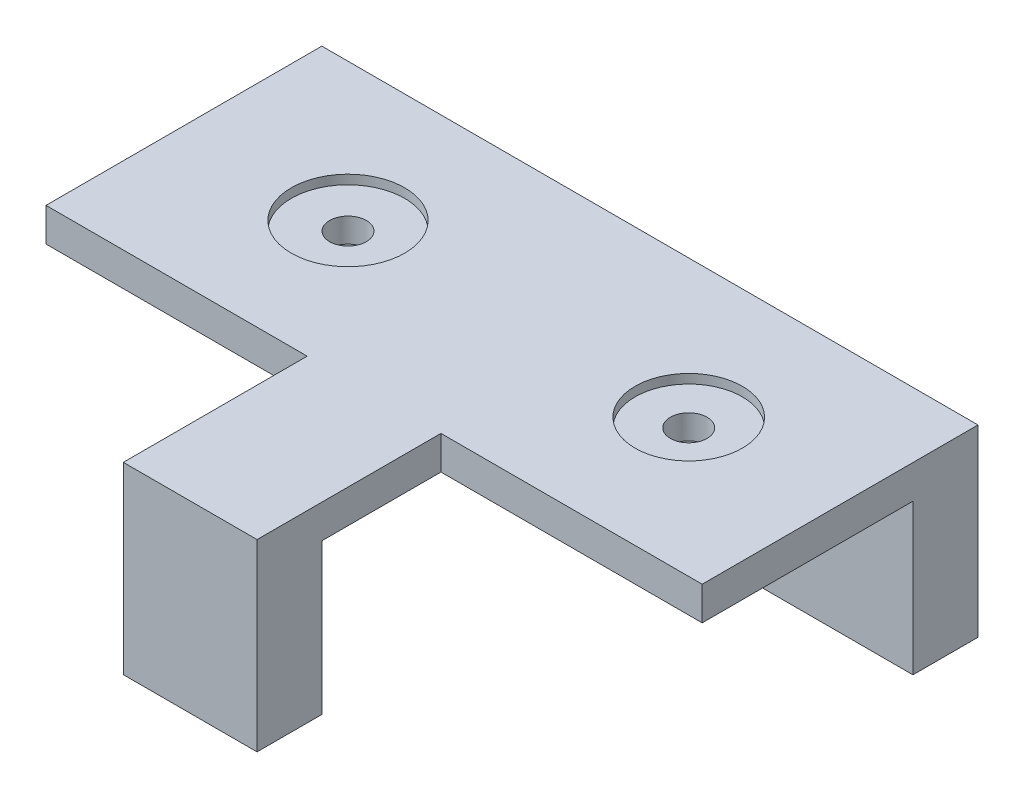
ISO-10303-21;
HEADER;
FILE_DESCRIPTION(('STEP AP214'),'2;1');
FILE_NAME('part.step','',(''),(''),'','','');
FILE_SCHEMA(('AUTOMOTIVE_DESIGN { 1 0 10303 214 1 1 1 1 }'));
ENDSEC;
DATA;
#1=APPLICATION_CONTEXT('core data for automotive mechanical design processes');
#2=APPLICATION_PROTOCOL_DEFINITION('international standard','automotive_design',2000,#1);
#3=PRODUCT_CONTEXT('',#1,'mechanical');
#4=PRODUCT('Part','Part','',(#3));
#5=PRODUCT_RELATED_PRODUCT_CATEGORY('part','',(#4));
#6=PRODUCT_DEFINITION_FORMATION('','',#4);
#7=PRODUCT_DEFINITION_CONTEXT('part definition',#1,'design');
#8=PRODUCT_DEFINITION('design','',#6,#7);
#9=PRODUCT_DEFINITION_SHAPE('','',#8);
#10=(LENGTH_UNIT() NAMED_UNIT(*) SI_UNIT(.MILLI.,.METRE.));
#11=(NAMED_UNIT(*) PLANE_ANGLE_UNIT() SI_UNIT($,.RADIAN.));
#12=(NAMED_UNIT(*) SI_UNIT($,.STERADIAN.) SOLID_ANGLE_UNIT());
#13=UNCERTAINTY_MEASURE_WITH_UNIT(LENGTH_MEASURE(1.E-05),#10,'distance_accuracy_value','');
#14=(GEOMETRIC_REPRESENTATION_CONTEXT(3) GLOBAL_UNCERTAINTY_ASSIGNED_CONTEXT((#13)) GLOBAL_UNIT_ASSIGNED_CONTEXT((#10,
#11,#12)) REPRESENTATION_CONTEXT('',''));
#15=CARTESIAN_POINT('',(0.,0.,0.));
#16=DIRECTION('',(0.,0.,1.));
#17=DIRECTION('',(1.,0.,0.));
#18=AXIS2_PLACEMENT_3D('',#15,#16,#17);
#19=CARTESIAN_POINT('',(57.6657292142728,0.,-30.));
#20=DIRECTION('',(0.,1.,0.));
#21=DIRECTION('',(0.,0.,1.));
#22=AXIS2_PLACEMENT_3D('',#19,#20,#21);
#23=CYLINDRICAL_SURFACE('',#22,6.);
#24=CARTESIAN_POINT('',(57.6657292142728,49.0674582250458,-30.));
#25=DIRECTION('',(0.,-1.,0.));
#26=DIRECTION('',(0.,0.,-1.));
#27=AXIS2_PLACEMENT_3D('',#24,#25,#26);
#28=CIRCLE('',#27,6.);
#29=CARTESIAN_POINT('',(57.6657292142728,49.0674582250458,-36.));
#30=VERTEX_POINT('',#29);
#31=EDGE_CURVE('E262',#30,#30,#28,.T.);
#32=ORIENTED_EDGE('',*,*,#31,.T.);
#33=EDGE_LOOP('',(#32));
#34=FACE_BOUND('',#33,.T.);
#35=CARTESIAN_POINT('',(57.6657292142728,57.,-30.));
#36=DIRECTION('',(0.,1.,0.));
#37=DIRECTION('',(0.,0.,1.));
#38=AXIS2_PLACEMENT_3D('',#35,#36,#37);
#39=CIRCLE('',#38,6.);
#40=CARTESIAN_POINT('',(57.6657292142728,57.,-24.));
#41=VERTEX_POINT('',#40);
#42=EDGE_CURVE('E48',#41,#41,#39,.F.);
#43=ORIENTED_EDGE('',*,*,#42,.F.);
#44=EDGE_LOOP('',(#43));
#45=FACE_BOUND('',#44,.T.);
#46=ADVANCED_FACE('F44',(#34,#45),#23,.F.);
#47=CARTESIAN_POINT('',(-53.5171156017352,0.,-30.));
#48=DIRECTION('',(0.,1.,0.));
#49=DIRECTION('',(0.,0.,1.));
#50=AXIS2_PLACEMENT_3D('',#47,#48,#49);
#51=CYLINDRICAL_SURFACE('',#50,6.);
#52=CARTESIAN_POINT('',(-53.5171156017352,49.0674582250458,-30.));
#53=DIRECTION('',(0.,-1.,0.));
#54=DIRECTION('',(0.,0.,-1.));
#55=AXIS2_PLACEMENT_3D('',#52,#53,#54);
#56=CIRCLE('',#55,6.);
#57=CARTESIAN_POINT('',(-53.5171156017352,49.0674582250458,-36.));
#58=VERTEX_POINT('',#57);
#59=EDGE_CURVE('E175',#58,#58,#56,.T.);
#60=ORIENTED_EDGE('',*,*,#59,.T.);
#61=EDGE_LOOP('',(#60));
#62=FACE_BOUND('',#61,.T.);
#63=CARTESIAN_POINT('',(-53.5171156017352,57.,-30.));
#64=DIRECTION('',(0.,1.,0.));
#65=DIRECTION('',(0.,0.,1.));
#66=AXIS2_PLACEMENT_3D('',#63,#64,#65);
#67=CIRCLE('',#66,6.);
#68=CARTESIAN_POINT('',(-53.5171156017352,57.,-24.));
#69=VERTEX_POINT('',#68);
#70=EDGE_CURVE('E266',#69,#69,#67,.F.);
#71=ORIENTED_EDGE('',*,*,#70,.F.);
#72=EDGE_LOOP('',(#71));
#73=FACE_BOUND('',#72,.T.);
#74=ADVANCED_FACE('F332',(#62,#73),#51,.F.);
#75=CARTESIAN_POINT('',(-107.047193877551,60.,-75.));
#76=DIRECTION('',(1.,0.,0.));
#77=DIRECTION('',(0.,0.,-1.));
#78=AXIS2_PLACEMENT_3D('',#75,#76,#77);
#79=PLANE('',#78);
#80=DIRECTION('',(0.,-1.,0.));
#81=VECTOR('',#80,1.);
#82=CARTESIAN_POINT('',(-107.047193877551,60.,15.));
#83=LINE('',#82,#81);
#84=CARTESIAN_POINT('',(-107.047193877551,60.,15.));
#85=VERTEX_POINT('',#84);
#86=CARTESIAN_POINT('',(-107.047193877551,49.0674582250458,15.));
#87=VERTEX_POINT('',#86);
#88=EDGE_CURVE('E142',#85,#87,#83,.T.);
#89=ORIENTED_EDGE('',*,*,#88,.F.);
#90=DIRECTION('',(0.,0.,1.));
#91=VECTOR('',#90,1.);
#92=CARTESIAN_POINT('',(-107.047193877551,60.,-75.));
#93=LINE('',#92,#91);
#94=CARTESIAN_POINT('',(-107.047193877551,60.,-75.));
#95=VERTEX_POINT('',#94);
#96=EDGE_CURVE('E159',#95,#85,#93,.T.);
#97=ORIENTED_EDGE('',*,*,#96,.F.);
#98=DIRECTION('',(0.,-1.,0.));
#99=VECTOR('',#98,1.);
#100=CARTESIAN_POINT('',(-107.047193877551,60.,-75.));
#101=LINE('',#100,#99);
#102=CARTESIAN_POINT('',(-107.047193877551,0.,-75.));
#103=VERTEX_POINT('',#102);
#104=EDGE_CURVE('E234',#95,#103,#101,.T.);
#105=ORIENTED_EDGE('',*,*,#104,.T.);
#106=DIRECTION('',(0.,0.,1.));
#107=VECTOR('',#106,1.);
#108=CARTESIAN_POINT('',(-107.047193877551,0.,-75.));
#109=LINE('',#108,#107);
#110=CARTESIAN_POINT('',(-107.047193877551,0.,-53.7725574944106));
#111=VERTEX_POINT('',#110);
#112=EDGE_CURVE('E240',#103,#111,#109,.T.);
#113=ORIENTED_EDGE('',*,*,#112,.T.);
#114=DIRECTION('',(0.,-1.,0.));
#115=VECTOR('',#114,1.);
#116=CARTESIAN_POINT('',(-107.047193877551,0.,-53.7725574944106));
#117=LINE('',#116,#115);
#118=CARTESIAN_POINT('',(-107.047193877551,49.0674582250458,-53.7725574944106));
#119=VERTEX_POINT('',#118);
#120=EDGE_CURVE('E201',#119,#111,#117,.T.);
#121=ORIENTED_EDGE('',*,*,#120,.F.);
#122=DIRECTION('',(0.,0.,1.));
#123=VECTOR('',#122,1.);
#124=CARTESIAN_POINT('',(-107.047193877551,49.0674582250458,0.));
#125=LINE('',#124,#123);
#126=EDGE_CURVE('E192',#119,#87,#125,.T.);
#127=ORIENTED_EDGE('',*,*,#126,.T.);
#128=EDGE_LOOP('',(#89,#97,#105,#113,#121,#127));
#129=FACE_BOUND('',#128,.T.);
#130=ADVANCED_FACE('F293',(#129),#79,.F.);
#131=CARTESIAN_POINT('',(107.047193877551,60.,-75.));
#132=DIRECTION('',(-1.,0.,0.));
#133=DIRECTION('',(0.,0.,1.));
#134=AXIS2_PLACEMENT_3D('',#131,#132,#133);
#135=PLANE('',#134);
#136=DIRECTION('',(0.,0.,-1.));
#137=VECTOR('',#136,1.);
#138=CARTESIAN_POINT('',(107.047193877551,60.,-75.));
#139=LINE('',#138,#137);
#140=CARTESIAN_POINT('',(107.047193877551,60.,15.));
#141=VERTEX_POINT('',#140);
#142=CARTESIAN_POINT('',(107.047193877551,60.,-75.));
#143=VERTEX_POINT('',#142);
#144=EDGE_CURVE('E222',#141,#143,#139,.T.);
#145=ORIENTED_EDGE('',*,*,#144,.F.);
#146=DIRECTION('',(0.,1.,0.));
#147=VECTOR('',#146,1.);
#148=CARTESIAN_POINT('',(107.047193877551,60.,15.));
#149=LINE('',#148,#147);
#150=CARTESIAN_POINT('',(107.047193877551,49.0674582250458,15.));
#151=VERTEX_POINT('',#150);
#152=EDGE_CURVE('E178',#151,#141,#149,.T.);
#153=ORIENTED_EDGE('',*,*,#152,.F.);
#154=DIRECTION('',(0.,0.,-1.));
#155=VECTOR('',#154,1.);
#156=CARTESIAN_POINT('',(107.047193877551,49.0674582250458,0.));
#157=LINE('',#156,#155);
#158=CARTESIAN_POINT('',(107.047193877551,49.0674582250458,-53.7725574944106));
#159=VERTEX_POINT('',#158);
#160=EDGE_CURVE('E193',#151,#159,#157,.T.);
#161=ORIENTED_EDGE('',*,*,#160,.T.);
#162=DIRECTION('',(0.,1.,0.));
#163=VECTOR('',#162,1.);
#164=CARTESIAN_POINT('',(107.047193877551,0.,-53.7725574944106));
#165=LINE('',#164,#163);
#166=CARTESIAN_POINT('',(107.047193877551,0.,-53.7725574944106));
#167=VERTEX_POINT('',#166);
#168=EDGE_CURVE('E196',#167,#159,#165,.T.);
#169=ORIENTED_EDGE('',*,*,#168,.F.);
#170=DIRECTION('',(0.,0.,-1.));
#171=VECTOR('',#170,1.);
#172=CARTESIAN_POINT('',(107.047193877551,0.,-75.));
#173=LINE('',#172,#171);
#174=CARTESIAN_POINT('',(107.047193877551,0.,-75.));
#175=VERTEX_POINT('',#174);
#176=EDGE_CURVE('E221',#167,#175,#173,.T.);
#177=ORIENTED_EDGE('',*,*,#176,.T.);
#178=DIRECTION('',(0.,-1.,0.));
#179=VECTOR('',#178,1.);
#180=CARTESIAN_POINT('',(107.047193877551,60.,-75.));
#181=LINE('',#180,#179);
#182=EDGE_CURVE('E250',#143,#175,#181,.T.);
#183=ORIENTED_EDGE('',*,*,#182,.F.);
#184=EDGE_LOOP('',(#145,#153,#161,#169,#177,#183));
#185=FACE_BOUND('',#184,.T.);
#186=ADVANCED_FACE('F46',(#185),#135,.F.);
#187=CARTESIAN_POINT('',(0.,0.,0.));
#188=DIRECTION('',(0.,1.,0.));
#189=DIRECTION('',(0.,0.,1.));
#190=AXIS2_PLACEMENT_3D('',#187,#188,#189);
#191=PLANE('',#190);
#192=DIRECTION('',(1.,0.,0.));
#193=VECTOR('',#192,1.);
#194=CARTESIAN_POINT('',(-107.047193877551,0.,75.));
#195=LINE('',#194,#193);
#196=CARTESIAN_POINT('',(-21.8217076019478,0.,75.));
#197=VERTEX_POINT('',#196);
#198=CARTESIAN_POINT('',(21.817193877551,0.,75.));
#199=VERTEX_POINT('',#198);
#200=EDGE_CURVE('E226',#197,#199,#195,.T.);
#201=ORIENTED_EDGE('',*,*,#200,.F.);
#202=DIRECTION('',(0.,0.,1.));
#203=VECTOR('',#202,1.);
#204=CARTESIAN_POINT('',(-21.8217076019478,0.,15.));
#205=LINE('',#204,#203);
#206=CARTESIAN_POINT('',(-21.8217076019478,0.,53.7725574944106));
#207=VERTEX_POINT('',#206);
#208=EDGE_CURVE('E154',#207,#197,#205,.T.);
#209=ORIENTED_EDGE('',*,*,#208,.F.);
#210=DIRECTION('',(-1.,0.,0.));
#211=VECTOR('',#210,1.);
#212=CARTESIAN_POINT('',(225.257037861144,0.,53.7725574944106));
#213=LINE('',#212,#211);
#214=CARTESIAN_POINT('',(21.817193877551,0.,53.7725574944106));
#215=VERTEX_POINT('',#214);
#216=EDGE_CURVE('E208',#215,#207,#213,.T.);
#217=ORIENTED_EDGE('',*,*,#216,.F.);
#218=DIRECTION('',(0.,0.,1.));
#219=VECTOR('',#218,1.);
#220=CARTESIAN_POINT('',(21.817193877551,0.,15.));
#221=LINE('',#220,#219);
#222=EDGE_CURVE('E70',#215,#199,#221,.T.);
#223=ORIENTED_EDGE('',*,*,#222,.T.);
#224=EDGE_LOOP('',(#201,#209,#217,#223));
#225=FACE_BOUND('',#224,.T.);
#226=ADVANCED_FACE('F320',(#225),#191,.F.);
#227=CARTESIAN_POINT('',(-107.047193877551,60.,-75.));
#228=DIRECTION('',(0.,0.,1.));
#229=DIRECTION('',(1.,0.,0.));
#230=AXIS2_PLACEMENT_3D('',#227,#228,#229);
#231=PLANE('',#230);
#232=DIRECTION('',(-1.,0.,0.));
#233=VECTOR('',#232,1.);
#234=CARTESIAN_POINT('',(-107.047193877551,0.,-75.));
#235=LINE('',#234,#233);
#236=EDGE_CURVE('E237',#175,#103,#235,.T.);
#237=ORIENTED_EDGE('',*,*,#236,.T.);
#238=ORIENTED_EDGE('',*,*,#104,.F.);
#239=DIRECTION('',(-1.,0.,0.));
#240=VECTOR('',#239,1.);
#241=CARTESIAN_POINT('',(-107.047193877551,60.,-75.));
#242=LINE('',#241,#240);
#243=EDGE_CURVE('E225',#143,#95,#242,.T.);
#244=ORIENTED_EDGE('',*,*,#243,.F.);
#245=ORIENTED_EDGE('',*,*,#182,.T.);
#246=EDGE_LOOP('',(#237,#238,#244,#245));
#247=FACE_BOUND('',#246,.T.);
#248=ADVANCED_FACE('F317',(#247),#231,.F.);
#249=CARTESIAN_POINT('',(-107.047193877551,60.,75.));
#250=DIRECTION('',(0.,0.,-1.));
#251=DIRECTION('',(-1.,0.,0.));
#252=AXIS2_PLACEMENT_3D('',#249,#250,#251);
#253=PLANE('',#252);
#254=DIRECTION('',(1.,0.,0.));
#255=VECTOR('',#254,1.);
#256=CARTESIAN_POINT('',(-107.047193877551,60.,75.));
#257=LINE('',#256,#255);
#258=CARTESIAN_POINT('',(-21.8217076019478,60.,75.));
#259=VERTEX_POINT('',#258);
#260=CARTESIAN_POINT('',(21.817193877551,60.,75.));
#261=VERTEX_POINT('',#260);
#262=EDGE_CURVE('E231',#259,#261,#257,.T.);
#263=ORIENTED_EDGE('',*,*,#262,.F.);
#264=DIRECTION('',(0.,1.,0.));
#265=VECTOR('',#264,1.);
#266=CARTESIAN_POINT('',(-21.8217076019478,60.,75.));
#267=LINE('',#266,#265);
#268=EDGE_CURVE('E148',#197,#259,#267,.T.);
#269=ORIENTED_EDGE('',*,*,#268,.F.);
#270=ORIENTED_EDGE('',*,*,#200,.T.);
#271=DIRECTION('',(0.,-1.,0.));
#272=VECTOR('',#271,1.);
#273=CARTESIAN_POINT('',(21.817193877551,60.,75.));
#274=LINE('',#273,#272);
#275=EDGE_CURVE('E167',#261,#199,#274,.T.);
#276=ORIENTED_EDGE('',*,*,#275,.F.);
#277=EDGE_LOOP('',(#263,#269,#270,#276));
#278=FACE_BOUND('',#277,.T.);
#279=ADVANCED_FACE('F319',(#278),#253,.F.);
#280=CARTESIAN_POINT('',(0.,60.,0.));
#281=DIRECTION('',(0.,1.,0.));
#282=DIRECTION('',(0.,0.,1.));
#283=AXIS2_PLACEMENT_3D('',#280,#281,#282);
#284=PLANE('',#283);
#285=CARTESIAN_POINT('',(57.6657292142728,60.,-30.));
#286=DIRECTION('',(0.,1.,0.));
#287=DIRECTION('',(0.,0.,1.));
#288=AXIS2_PLACEMENT_3D('',#285,#286,#287);
#289=CIRCLE('',#288,17.5);
#290=CARTESIAN_POINT('',(57.6657292142728,60.,-12.5));
#291=VERTEX_POINT('',#290);
#292=EDGE_CURVE('E284',#291,#291,#289,.T.);
#293=ORIENTED_EDGE('',*,*,#292,.F.);
#294=EDGE_LOOP('',(#293));
#295=FACE_BOUND('',#294,.T.);
#296=CARTESIAN_POINT('',(-53.5171156017352,60.,-30.));
#297=DIRECTION('',(0.,1.,0.));
#298=DIRECTION('',(0.,0.,1.));
#299=AXIS2_PLACEMENT_3D('',#296,#297,#298);
#300=CIRCLE('',#299,18.5);
#301=CARTESIAN_POINT('',(-53.5171156017352,60.,-11.5));
#302=VERTEX_POINT('',#301);
#303=EDGE_CURVE('E276',#302,#302,#300,.T.);
#304=ORIENTED_EDGE('',*,*,#303,.F.);
#305=EDGE_LOOP('',(#304));
#306=FACE_BOUND('',#305,.T.);
#307=DIRECTION('',(0.,0.,1.));
#308=VECTOR('',#307,1.);
#309=CARTESIAN_POINT('',(-21.8217076019478,60.,15.));
#310=LINE('',#309,#308);
#311=CARTESIAN_POINT('',(-21.8217076019478,60.,15.));
#312=VERTEX_POINT('',#311);
#313=EDGE_CURVE('E145',#312,#259,#310,.T.);
#314=ORIENTED_EDGE('',*,*,#313,.T.);
#315=ORIENTED_EDGE('',*,*,#262,.T.);
#316=DIRECTION('',(0.,0.,1.));
#317=VECTOR('',#316,1.);
#318=CARTESIAN_POINT('',(21.817193877551,60.,15.));
#319=LINE('',#318,#317);
#320=CARTESIAN_POINT('',(21.817193877551,60.,15.));
#321=VERTEX_POINT('',#320);
#322=EDGE_CURVE('E169',#321,#261,#319,.T.);
#323=ORIENTED_EDGE('',*,*,#322,.F.);
#324=DIRECTION('',(-1.,0.,0.));
#325=VECTOR('',#324,1.);
#326=CARTESIAN_POINT('',(107.047193877551,60.,15.));
#327=LINE('',#326,#325);
#328=EDGE_CURVE('E182',#141,#321,#327,.T.);
#329=ORIENTED_EDGE('',*,*,#328,.F.);
#330=ORIENTED_EDGE('',*,*,#144,.T.);
#331=ORIENTED_EDGE('',*,*,#243,.T.);
#332=ORIENTED_EDGE('',*,*,#96,.T.);
#333=DIRECTION('',(-1.,0.,0.));
#334=VECTOR('',#333,1.);
#335=CARTESIAN_POINT('',(-107.047193877551,60.,15.));
#336=LINE('',#335,#334);
#337=EDGE_CURVE('E139',#312,#85,#336,.T.);
#338=ORIENTED_EDGE('',*,*,#337,.F.);
#339=EDGE_LOOP('',(#314,#315,#323,#329,#330,#331,#332,#338));
#340=FACE_BOUND('',#339,.T.);
#341=ADVANCED_FACE('F157',(#295,#306,#340),#284,.T.);
#342=ORIENTED_EDGE('',*,*,#176,.F.);
#343=DIRECTION('',(-1.,0.,0.));
#344=VECTOR('',#343,1.);
#345=CARTESIAN_POINT('',(225.257037861144,0.,-53.7725574944106));
#346=LINE('',#345,#344);
#347=EDGE_CURVE('E212',#167,#111,#346,.T.);
#348=ORIENTED_EDGE('',*,*,#347,.T.);
#349=ORIENTED_EDGE('',*,*,#112,.F.);
#350=ORIENTED_EDGE('',*,*,#236,.F.);
#351=EDGE_LOOP('',(#342,#348,#349,#350));
#352=FACE_BOUND('',#351,.T.);
#353=ADVANCED_FACE('F300',(#352),#191,.F.);
#354=CARTESIAN_POINT('',(225.257037861144,49.0674582250458,0.));
#355=DIRECTION('',(0.,-1.,0.));
#356=DIRECTION('',(0.,0.,-1.));
#357=AXIS2_PLACEMENT_3D('',#354,#355,#356);
#358=PLANE('',#357);
#359=ORIENTED_EDGE('',*,*,#59,.F.);
#360=EDGE_LOOP('',(#359));
#361=FACE_BOUND('',#360,.T.);
#362=ORIENTED_EDGE('',*,*,#31,.F.);
#363=EDGE_LOOP('',(#362));
#364=FACE_BOUND('',#363,.T.);
#365=DIRECTION('',(0.,0.,1.));
#366=VECTOR('',#365,1.);
#367=CARTESIAN_POINT('',(-21.8217076019478,49.0674582250458,0.));
#368=LINE('',#367,#366);
#369=CARTESIAN_POINT('',(-21.8217076019478,49.0674582250458,15.));
#370=VERTEX_POINT('',#369);
#371=CARTESIAN_POINT('',(-21.8217076019478,49.0674582250458,53.7725574944106));
#372=VERTEX_POINT('',#371);
#373=EDGE_CURVE('E62',#370,#372,#368,.T.);
#374=ORIENTED_EDGE('',*,*,#373,.F.);
#375=DIRECTION('',(-1.,0.,0.));
#376=VECTOR('',#375,1.);
#377=CARTESIAN_POINT('',(225.257037861144,49.0674582250458,15.));
#378=LINE('',#377,#376);
#379=EDGE_CURVE('E11',#370,#87,#378,.T.);
#380=ORIENTED_EDGE('',*,*,#379,.T.);
#381=ORIENTED_EDGE('',*,*,#126,.F.);
#382=DIRECTION('',(-1.,0.,0.));
#383=VECTOR('',#382,1.);
#384=CARTESIAN_POINT('',(225.257037861144,49.0674582250458,-53.7725574944106));
#385=LINE('',#384,#383);
#386=EDGE_CURVE('E204',#159,#119,#385,.T.);
#387=ORIENTED_EDGE('',*,*,#386,.F.);
#388=ORIENTED_EDGE('',*,*,#160,.F.);
#389=DIRECTION('',(1.,0.,0.));
#390=VECTOR('',#389,1.);
#391=CARTESIAN_POINT('',(225.257037861144,49.0674582250458,15.));
#392=LINE('',#391,#390);
#393=CARTESIAN_POINT('',(21.817193877551,49.0674582250458,15.));
#394=VERTEX_POINT('',#393);
#395=EDGE_CURVE('E54',#394,#151,#392,.T.);
#396=ORIENTED_EDGE('',*,*,#395,.F.);
#397=DIRECTION('',(0.,0.,-1.));
#398=VECTOR('',#397,1.);
#399=CARTESIAN_POINT('',(21.817193877551,49.0674582250458,0.));
#400=LINE('',#399,#398);
#401=CARTESIAN_POINT('',(21.817193877551,49.0674582250458,53.7725574944106));
#402=VERTEX_POINT('',#401);
#403=EDGE_CURVE('E153',#402,#394,#400,.T.);
#404=ORIENTED_EDGE('',*,*,#403,.F.);
#405=DIRECTION('',(-1.,0.,0.));
#406=VECTOR('',#405,1.);
#407=CARTESIAN_POINT('',(225.257037861144,49.0674582250458,53.7725574944106));
#408=LINE('',#407,#406);
#409=EDGE_CURVE('E197',#402,#372,#408,.T.);
#410=ORIENTED_EDGE('',*,*,#409,.T.);
#411=EDGE_LOOP('',(#374,#380,#381,#387,#388,#396,#404,#410));
#412=FACE_BOUND('',#411,.T.);
#413=ADVANCED_FACE('F290',(#361,#364,#412),#358,.T.);
#414=CARTESIAN_POINT('',(225.257037861144,0.,53.7725574944106));
#415=DIRECTION('',(0.,0.,-1.));
#416=DIRECTION('',(-1.,0.,0.));
#417=AXIS2_PLACEMENT_3D('',#414,#415,#416);
#418=PLANE('',#417);
#419=DIRECTION('',(0.,-1.,0.));
#420=VECTOR('',#419,1.);
#421=CARTESIAN_POINT('',(-21.8217076019478,0.,53.7725574944106));
#422=LINE('',#421,#420);
#423=EDGE_CURVE('E257',#372,#207,#422,.T.);
#424=ORIENTED_EDGE('',*,*,#423,.F.);
#425=ORIENTED_EDGE('',*,*,#409,.F.);
#426=DIRECTION('',(0.,1.,0.));
#427=VECTOR('',#426,1.);
#428=CARTESIAN_POINT('',(21.817193877551,0.,53.7725574944106));
#429=LINE('',#428,#427);
#430=EDGE_CURVE('E254',#215,#402,#429,.T.);
#431=ORIENTED_EDGE('',*,*,#430,.F.);
#432=ORIENTED_EDGE('',*,*,#216,.T.);
#433=EDGE_LOOP('',(#424,#425,#431,#432));
#434=FACE_BOUND('',#433,.T.);
#435=ADVANCED_FACE('F355',(#434),#418,.T.);
#436=CARTESIAN_POINT('',(225.257037861144,0.,-53.7725574944106));
#437=DIRECTION('',(0.,0.,-1.));
#438=DIRECTION('',(-1.,0.,0.));
#439=AXIS2_PLACEMENT_3D('',#436,#437,#438);
#440=PLANE('',#439);
#441=ORIENTED_EDGE('',*,*,#168,.T.);
#442=ORIENTED_EDGE('',*,*,#386,.T.);
#443=ORIENTED_EDGE('',*,*,#120,.T.);
#444=ORIENTED_EDGE('',*,*,#347,.F.);
#445=EDGE_LOOP('',(#441,#442,#443,#444));
#446=FACE_BOUND('',#445,.T.);
#447=ADVANCED_FACE('F296',(#446),#440,.F.);
#448=CARTESIAN_POINT('',(21.817193877551,60.,15.));
#449=DIRECTION('',(-1.,0.,0.));
#450=DIRECTION('',(0.,-1.,0.));
#451=AXIS2_PLACEMENT_3D('',#448,#449,#450);
#452=PLANE('',#451);
#453=ORIENTED_EDGE('',*,*,#403,.T.);
#454=DIRECTION('',(0.,-1.,0.));
#455=VECTOR('',#454,1.);
#456=CARTESIAN_POINT('',(21.817193877551,60.,15.));
#457=LINE('',#456,#455);
#458=EDGE_CURVE('E172',#321,#394,#457,.T.);
#459=ORIENTED_EDGE('',*,*,#458,.F.);
#460=ORIENTED_EDGE('',*,*,#322,.T.);
#461=ORIENTED_EDGE('',*,*,#275,.T.);
#462=ORIENTED_EDGE('',*,*,#222,.F.);
#463=ORIENTED_EDGE('',*,*,#430,.T.);
#464=EDGE_LOOP('',(#453,#459,#460,#461,#462,#463));
#465=FACE_BOUND('',#464,.T.);
#466=ADVANCED_FACE('F350',(#465),#452,.F.);
#467=CARTESIAN_POINT('',(0.,0.,15.));
#468=DIRECTION('',(0.,0.,-1.));
#469=DIRECTION('',(-1.,0.,0.));
#470=AXIS2_PLACEMENT_3D('',#467,#468,#469);
#471=PLANE('',#470);
#472=ORIENTED_EDGE('',*,*,#395,.T.);
#473=ORIENTED_EDGE('',*,*,#152,.T.);
#474=ORIENTED_EDGE('',*,*,#328,.T.);
#475=ORIENTED_EDGE('',*,*,#458,.T.);
#476=EDGE_LOOP('',(#472,#473,#474,#475));
#477=FACE_BOUND('',#476,.T.);
#478=ADVANCED_FACE('F311',(#477),#471,.F.);
#479=CARTESIAN_POINT('',(-21.8217076019478,60.,15.));
#480=DIRECTION('',(1.,0.,0.));
#481=DIRECTION('',(0.,0.,-1.));
#482=AXIS2_PLACEMENT_3D('',#479,#480,#481);
#483=PLANE('',#482);
#484=ORIENTED_EDGE('',*,*,#373,.T.);
#485=ORIENTED_EDGE('',*,*,#423,.T.);
#486=ORIENTED_EDGE('',*,*,#208,.T.);
#487=ORIENTED_EDGE('',*,*,#268,.T.);
#488=ORIENTED_EDGE('',*,*,#313,.F.);
#489=DIRECTION('',(0.,1.,0.));
#490=VECTOR('',#489,1.);
#491=CARTESIAN_POINT('',(-21.8217076019478,60.,15.));
#492=LINE('',#491,#490);
#493=EDGE_CURVE('E135',#370,#312,#492,.T.);
#494=ORIENTED_EDGE('',*,*,#493,.F.);
#495=EDGE_LOOP('',(#484,#485,#486,#487,#488,#494));
#496=FACE_BOUND('',#495,.T.);
#497=ADVANCED_FACE('F146',(#496),#483,.F.);
#498=CARTESIAN_POINT('',(0.,0.,15.));
#499=DIRECTION('',(0.,0.,1.));
#500=DIRECTION('',(1.,0.,0.));
#501=AXIS2_PLACEMENT_3D('',#498,#499,#500);
#502=PLANE('',#501);
#503=ORIENTED_EDGE('',*,*,#493,.T.);
#504=ORIENTED_EDGE('',*,*,#337,.T.);
#505=ORIENTED_EDGE('',*,*,#88,.T.);
#506=ORIENTED_EDGE('',*,*,#379,.F.);
#507=EDGE_LOOP('',(#503,#504,#505,#506));
#508=FACE_BOUND('',#507,.T.);
#509=ADVANCED_FACE('F137',(#508),#502,.T.);
#510=CARTESIAN_POINT('',(-53.5171156017352,57.,-30.));
#511=DIRECTION('',(0.,1.,0.));
#512=DIRECTION('',(0.,0.,1.));
#513=AXIS2_PLACEMENT_3D('',#510,#511,#512);
#514=PLANE('',#513);
#515=CARTESIAN_POINT('',(-53.5171156017352,57.,-30.));
#516=DIRECTION('',(0.,1.,0.));
#517=DIRECTION('',(0.,0.,1.));
#518=AXIS2_PLACEMENT_3D('',#515,#516,#517);
#519=CIRCLE('',#518,18.5);
#520=CARTESIAN_POINT('',(-53.5171156017352,57.,-11.5));
#521=VERTEX_POINT('',#520);
#522=EDGE_CURVE('E271',#521,#521,#519,.T.);
#523=ORIENTED_EDGE('',*,*,#522,.T.);
#524=EDGE_LOOP('',(#523));
#525=FACE_BOUND('',#524,.T.);
#526=ORIENTED_EDGE('',*,*,#70,.T.);
#527=EDGE_LOOP('',(#526));
#528=FACE_BOUND('',#527,.T.);
#529=ADVANCED_FACE('F347',(#525,#528),#514,.T.);
#530=CARTESIAN_POINT('',(-53.5171156017352,57.,-30.));
#531=DIRECTION('',(0.,1.,0.));
#532=DIRECTION('',(0.,0.,1.));
#533=AXIS2_PLACEMENT_3D('',#530,#531,#532);
#534=CYLINDRICAL_SURFACE('',#533,18.5);
#535=ORIENTED_EDGE('',*,*,#522,.F.);
#536=EDGE_LOOP('',(#535));
#537=FACE_BOUND('',#536,.T.);
#538=ORIENTED_EDGE('',*,*,#303,.T.);
#539=EDGE_LOOP('',(#538));
#540=FACE_BOUND('',#539,.T.);
#541=ADVANCED_FACE('F424',(#537,#540),#534,.F.);
#542=CARTESIAN_POINT('',(57.6657292142728,57.,-30.));
#543=DIRECTION('',(0.,1.,0.));
#544=DIRECTION('',(0.,0.,1.));
#545=AXIS2_PLACEMENT_3D('',#542,#543,#544);
#546=PLANE('',#545);
#547=CARTESIAN_POINT('',(57.6657292142728,57.,-30.));
#548=DIRECTION('',(0.,1.,0.));
#549=DIRECTION('',(0.,0.,1.));
#550=AXIS2_PLACEMENT_3D('',#547,#548,#549);
#551=CIRCLE('',#550,17.5);
#552=CARTESIAN_POINT('',(57.6657292142728,57.,-12.5));
#553=VERTEX_POINT('',#552);
#554=EDGE_CURVE('E462',#553,#553,#551,.T.);
#555=ORIENTED_EDGE('',*,*,#554,.T.);
#556=EDGE_LOOP('',(#555));
#557=FACE_BOUND('',#556,.T.);
#558=ORIENTED_EDGE('',*,*,#42,.T.);
#559=EDGE_LOOP('',(#558));
#560=FACE_BOUND('',#559,.T.);
#561=ADVANCED_FACE('F430',(#557,#560),#546,.T.);
#562=CARTESIAN_POINT('',(57.6657292142728,57.,-30.));
#563=DIRECTION('',(0.,1.,0.));
#564=DIRECTION('',(0.,0.,1.));
#565=AXIS2_PLACEMENT_3D('',#562,#563,#564);
#566=CYLINDRICAL_SURFACE('',#565,17.5);
#567=ORIENTED_EDGE('',*,*,#554,.F.);
#568=EDGE_LOOP('',(#567));
#569=FACE_BOUND('',#568,.T.);
#570=ORIENTED_EDGE('',*,*,#292,.T.);
#571=EDGE_LOOP('',(#570));
#572=FACE_BOUND('',#571,.T.);
#573=ADVANCED_FACE('F446',(#569,#572),#566,.F.);
#574=CLOSED_SHELL('',(#46,#74,#130,#186,#226,#248,#279,#341,#353,#413,#435,#447,#466,#478,#497,
#509,#529,#541,#561,#573));
#575=MANIFOLD_SOLID_BREP('B2',#574);
#576=ADVANCED_BREP_SHAPE_REPRESENTATION('',(#18,#575),#14);
#577=SHAPE_DEFINITION_REPRESENTATION(#9,#576);
ENDSEC;
END-ISO-10303-21;
